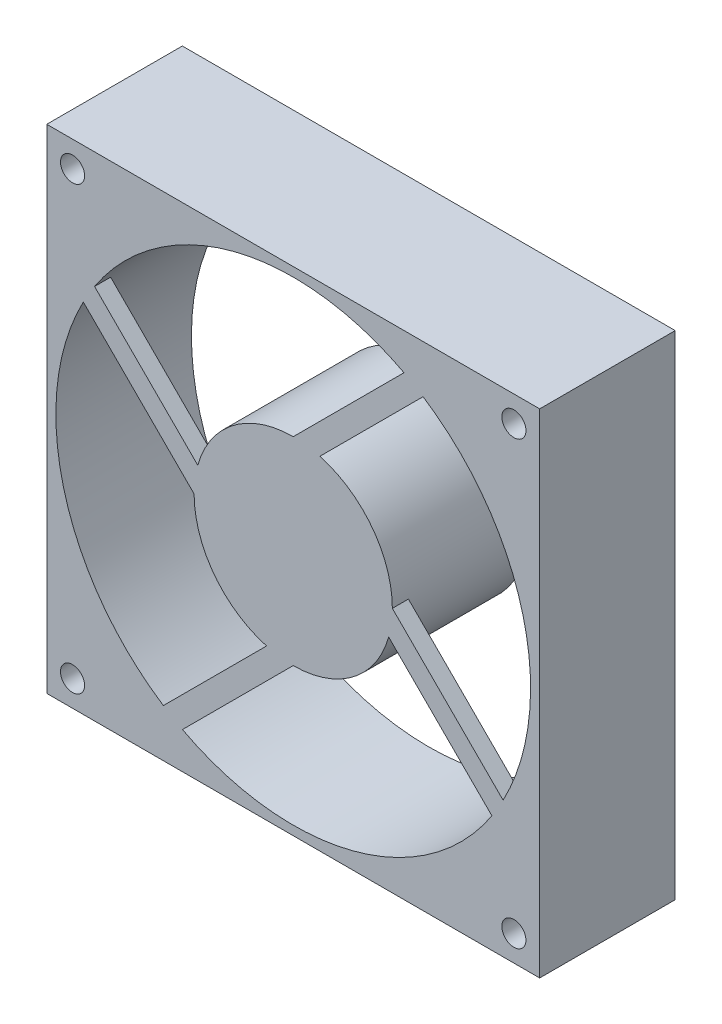
ISO-10303-21;
HEADER;
FILE_DESCRIPTION(('STEP AP214'),'2;1');
FILE_NAME('part.step','',(''),(''),'','','');
FILE_SCHEMA(('AUTOMOTIVE_DESIGN { 1 0 10303 214 1 1 1 1 }'));
ENDSEC;
DATA;
#1=APPLICATION_CONTEXT('core data for automotive mechanical design processes');
#2=APPLICATION_PROTOCOL_DEFINITION('international standard','automotive_design',2000,#1);
#3=PRODUCT_CONTEXT('',#1,'mechanical');
#4=PRODUCT('Part','Part','',(#3));
#5=PRODUCT_RELATED_PRODUCT_CATEGORY('part','',(#4));
#6=PRODUCT_DEFINITION_FORMATION('','',#4);
#7=PRODUCT_DEFINITION_CONTEXT('part definition',#1,'design');
#8=PRODUCT_DEFINITION('design','',#6,#7);
#9=PRODUCT_DEFINITION_SHAPE('','',#8);
#10=(LENGTH_UNIT() NAMED_UNIT(*) SI_UNIT(.MILLI.,.METRE.));
#11=(NAMED_UNIT(*) PLANE_ANGLE_UNIT() SI_UNIT($,.RADIAN.));
#12=(NAMED_UNIT(*) SI_UNIT($,.STERADIAN.) SOLID_ANGLE_UNIT());
#13=UNCERTAINTY_MEASURE_WITH_UNIT(LENGTH_MEASURE(1.E-05),#10,'distance_accuracy_value','');
#14=(GEOMETRIC_REPRESENTATION_CONTEXT(3) GLOBAL_UNCERTAINTY_ASSIGNED_CONTEXT((#13)) GLOBAL_UNIT_ASSIGNED_CONTEXT((#10,
#11,#12)) REPRESENTATION_CONTEXT('',''));
#15=CARTESIAN_POINT('',(0.,0.,0.));
#16=DIRECTION('',(0.,0.,1.));
#17=DIRECTION('',(1.,0.,0.));
#18=AXIS2_PLACEMENT_3D('',#15,#16,#17);
#19=CARTESIAN_POINT('',(0.,-46.,12.65));
#20=DIRECTION('',(0.,1.,0.));
#21=DIRECTION('',(0.,0.,1.));
#22=AXIS2_PLACEMENT_3D('',#19,#20,#21);
#23=PLANE('',#22);
#24=DIRECTION('',(1.,0.,0.));
#25=VECTOR('',#24,1.);
#26=CARTESIAN_POINT('',(0.,-46.,-12.65));
#27=LINE('',#26,#25);
#28=CARTESIAN_POINT('',(-46.,-46.,-12.65));
#29=VERTEX_POINT('',#28);
#30=CARTESIAN_POINT('',(46.,-46.,-12.65));
#31=VERTEX_POINT('',#30);
#32=EDGE_CURVE('E355',#29,#31,#27,.T.);
#33=ORIENTED_EDGE('',*,*,#32,.T.);
#34=DIRECTION('',(0.,0.,-1.));
#35=VECTOR('',#34,1.);
#36=CARTESIAN_POINT('',(46.,-46.,12.65));
#37=LINE('',#36,#35);
#38=CARTESIAN_POINT('',(46.,-46.,12.65));
#39=VERTEX_POINT('',#38);
#40=EDGE_CURVE('E12',#39,#31,#37,.T.);
#41=ORIENTED_EDGE('',*,*,#40,.F.);
#42=DIRECTION('',(1.,0.,0.));
#43=VECTOR('',#42,1.);
#44=CARTESIAN_POINT('',(0.,-46.,12.65));
#45=LINE('',#44,#43);
#46=CARTESIAN_POINT('',(-46.,-46.,12.65));
#47=VERTEX_POINT('',#46);
#48=EDGE_CURVE('E329',#47,#39,#45,.T.);
#49=ORIENTED_EDGE('',*,*,#48,.F.);
#50=DIRECTION('',(0.,0.,-1.));
#51=VECTOR('',#50,1.);
#52=CARTESIAN_POINT('',(-46.,-46.,12.65));
#53=LINE('',#52,#51);
#54=EDGE_CURVE('E340',#47,#29,#53,.T.);
#55=ORIENTED_EDGE('',*,*,#54,.T.);
#56=EDGE_LOOP('',(#33,#41,#49,#55));
#57=FACE_BOUND('',#56,.T.);
#58=ADVANCED_FACE('F49',(#57),#23,.F.);
#59=CARTESIAN_POINT('',(46.,0.,12.65));
#60=DIRECTION('',(-1.,0.,0.));
#61=DIRECTION('',(0.,0.,1.));
#62=AXIS2_PLACEMENT_3D('',#59,#60,#61);
#63=PLANE('',#62);
#64=DIRECTION('',(0.,1.,0.));
#65=VECTOR('',#64,1.);
#66=CARTESIAN_POINT('',(46.,0.,-12.65));
#67=LINE('',#66,#65);
#68=CARTESIAN_POINT('',(46.,46.,-12.65));
#69=VERTEX_POINT('',#68);
#70=EDGE_CURVE('E358',#31,#69,#67,.T.);
#71=ORIENTED_EDGE('',*,*,#70,.T.);
#72=DIRECTION('',(0.,0.,-1.));
#73=VECTOR('',#72,1.);
#74=CARTESIAN_POINT('',(46.,46.,12.65));
#75=LINE('',#74,#73);
#76=CARTESIAN_POINT('',(46.,46.,12.65));
#77=VERTEX_POINT('',#76);
#78=EDGE_CURVE('E57',#77,#69,#75,.T.);
#79=ORIENTED_EDGE('',*,*,#78,.F.);
#80=DIRECTION('',(0.,1.,0.));
#81=VECTOR('',#80,1.);
#82=CARTESIAN_POINT('',(46.,0.,12.65));
#83=LINE('',#82,#81);
#84=EDGE_CURVE('E332',#39,#77,#83,.T.);
#85=ORIENTED_EDGE('',*,*,#84,.F.);
#86=ORIENTED_EDGE('',*,*,#40,.T.);
#87=EDGE_LOOP('',(#71,#79,#85,#86));
#88=FACE_BOUND('',#87,.T.);
#89=ADVANCED_FACE('F375',(#88),#63,.F.);
#90=CARTESIAN_POINT('',(0.,46.,12.65));
#91=DIRECTION('',(0.,1.,0.));
#92=DIRECTION('',(0.,0.,1.));
#93=AXIS2_PLACEMENT_3D('',#90,#91,#92);
#94=PLANE('',#93);
#95=DIRECTION('',(1.,0.,0.));
#96=VECTOR('',#95,1.);
#97=CARTESIAN_POINT('',(0.,46.,-12.65));
#98=LINE('',#97,#96);
#99=CARTESIAN_POINT('',(-46.,46.,-12.65));
#100=VERTEX_POINT('',#99);
#101=EDGE_CURVE('E361',#100,#69,#98,.T.);
#102=ORIENTED_EDGE('',*,*,#101,.F.);
#103=DIRECTION('',(0.,0.,-1.));
#104=VECTOR('',#103,1.);
#105=CARTESIAN_POINT('',(-46.,46.,12.65));
#106=LINE('',#105,#104);
#107=CARTESIAN_POINT('',(-46.,46.,12.65));
#108=VERTEX_POINT('',#107);
#109=EDGE_CURVE('E368',#108,#100,#106,.T.);
#110=ORIENTED_EDGE('',*,*,#109,.F.);
#111=DIRECTION('',(1.,0.,0.));
#112=VECTOR('',#111,1.);
#113=CARTESIAN_POINT('',(0.,46.,12.65));
#114=LINE('',#113,#112);
#115=EDGE_CURVE('E334',#108,#77,#114,.T.);
#116=ORIENTED_EDGE('',*,*,#115,.T.);
#117=ORIENTED_EDGE('',*,*,#78,.T.);
#118=EDGE_LOOP('',(#102,#110,#116,#117));
#119=FACE_BOUND('',#118,.T.);
#120=ADVANCED_FACE('F372',(#119),#94,.T.);
#121=CARTESIAN_POINT('',(-41.1889700041164,41.1889700041164,12.65));
#122=DIRECTION('',(0.,0.,-1.));
#123=DIRECTION('',(-1.,0.,0.));
#124=AXIS2_PLACEMENT_3D('',#121,#122,#123);
#125=CYLINDRICAL_SURFACE('',#124,2.25);
#126=CARTESIAN_POINT('',(-41.1889700041164,41.1889700041164,12.65));
#127=DIRECTION('',(0.,0.,1.));
#128=DIRECTION('',(1.,0.,0.));
#129=AXIS2_PLACEMENT_3D('',#126,#127,#128);
#130=CIRCLE('',#129,2.25);
#131=CARTESIAN_POINT('',(-38.9389700041164,41.1889700041164,12.65));
#132=VERTEX_POINT('',#131);
#133=EDGE_CURVE('E326',#132,#132,#130,.T.);
#134=ORIENTED_EDGE('',*,*,#133,.T.);
#135=EDGE_LOOP('',(#134));
#136=FACE_BOUND('',#135,.T.);
#137=CARTESIAN_POINT('',(-41.1889700041164,41.1889700041164,-12.65));
#138=DIRECTION('',(0.,0.,1.));
#139=DIRECTION('',(1.,0.,0.));
#140=AXIS2_PLACEMENT_3D('',#137,#138,#139);
#141=CIRCLE('',#140,2.25);
#142=CARTESIAN_POINT('',(-38.9389700041164,41.1889700041164,-12.65));
#143=VERTEX_POINT('',#142);
#144=EDGE_CURVE('E352',#143,#143,#141,.T.);
#145=ORIENTED_EDGE('',*,*,#144,.F.);
#146=EDGE_LOOP('',(#145));
#147=FACE_BOUND('',#146,.T.);
#148=ADVANCED_FACE('F396',(#136,#147),#125,.F.);
#149=CARTESIAN_POINT('',(41.1889700041164,41.1889700041164,12.65));
#150=DIRECTION('',(0.,0.,-1.));
#151=DIRECTION('',(-1.,0.,0.));
#152=AXIS2_PLACEMENT_3D('',#149,#150,#151);
#153=CYLINDRICAL_SURFACE('',#152,2.25);
#154=CARTESIAN_POINT('',(41.1889700041164,41.1889700041164,12.65));
#155=DIRECTION('',(0.,0.,1.));
#156=DIRECTION('',(1.,0.,0.));
#157=AXIS2_PLACEMENT_3D('',#154,#155,#156);
#158=CIRCLE('',#157,2.25);
#159=CARTESIAN_POINT('',(43.4389700041164,41.1889700041164,12.65));
#160=VERTEX_POINT('',#159);
#161=EDGE_CURVE('E323',#160,#160,#158,.T.);
#162=ORIENTED_EDGE('',*,*,#161,.T.);
#163=EDGE_LOOP('',(#162));
#164=FACE_BOUND('',#163,.T.);
#165=CARTESIAN_POINT('',(41.1889700041164,41.1889700041164,-12.65));
#166=DIRECTION('',(0.,0.,1.));
#167=DIRECTION('',(1.,0.,0.));
#168=AXIS2_PLACEMENT_3D('',#165,#166,#167);
#169=CIRCLE('',#168,2.25);
#170=CARTESIAN_POINT('',(43.4389700041164,41.1889700041164,-12.65));
#171=VERTEX_POINT('',#170);
#172=EDGE_CURVE('E349',#171,#171,#169,.T.);
#173=ORIENTED_EDGE('',*,*,#172,.F.);
#174=EDGE_LOOP('',(#173));
#175=FACE_BOUND('',#174,.T.);
#176=ADVANCED_FACE('F399',(#164,#175),#153,.F.);
#177=CARTESIAN_POINT('',(41.1889700041164,-41.1889700041164,12.65));
#178=DIRECTION('',(0.,0.,-1.));
#179=DIRECTION('',(-1.,0.,0.));
#180=AXIS2_PLACEMENT_3D('',#177,#178,#179);
#181=CYLINDRICAL_SURFACE('',#180,2.25);
#182=CARTESIAN_POINT('',(41.1889700041164,-41.1889700041164,12.65));
#183=DIRECTION('',(0.,0.,1.));
#184=DIRECTION('',(1.,0.,0.));
#185=AXIS2_PLACEMENT_3D('',#182,#183,#184);
#186=CIRCLE('',#185,2.25);
#187=CARTESIAN_POINT('',(43.4389700041164,-41.1889700041164,12.65));
#188=VERTEX_POINT('',#187);
#189=EDGE_CURVE('E320',#188,#188,#186,.T.);
#190=ORIENTED_EDGE('',*,*,#189,.T.);
#191=EDGE_LOOP('',(#190));
#192=FACE_BOUND('',#191,.T.);
#193=CARTESIAN_POINT('',(41.1889700041164,-41.1889700041164,-12.65));
#194=DIRECTION('',(0.,0.,1.));
#195=DIRECTION('',(1.,0.,0.));
#196=AXIS2_PLACEMENT_3D('',#193,#194,#195);
#197=CIRCLE('',#196,2.25);
#198=CARTESIAN_POINT('',(43.4389700041164,-41.1889700041164,-12.65));
#199=VERTEX_POINT('',#198);
#200=EDGE_CURVE('E346',#199,#199,#197,.T.);
#201=ORIENTED_EDGE('',*,*,#200,.F.);
#202=EDGE_LOOP('',(#201));
#203=FACE_BOUND('',#202,.T.);
#204=ADVANCED_FACE('F403',(#192,#203),#181,.F.);
#205=CARTESIAN_POINT('',(-41.1889700041164,-41.1889700041164,12.65));
#206=DIRECTION('',(0.,0.,-1.));
#207=DIRECTION('',(-1.,0.,0.));
#208=AXIS2_PLACEMENT_3D('',#205,#206,#207);
#209=CYLINDRICAL_SURFACE('',#208,2.25);
#210=CARTESIAN_POINT('',(-41.1889700041164,-41.1889700041164,12.65));
#211=DIRECTION('',(0.,0.,1.));
#212=DIRECTION('',(1.,0.,0.));
#213=AXIS2_PLACEMENT_3D('',#210,#211,#212);
#214=CIRCLE('',#213,2.25);
#215=CARTESIAN_POINT('',(-38.9389700041164,-41.1889700041164,12.65));
#216=VERTEX_POINT('',#215);
#217=EDGE_CURVE('E315',#216,#216,#214,.T.);
#218=ORIENTED_EDGE('',*,*,#217,.T.);
#219=EDGE_LOOP('',(#218));
#220=FACE_BOUND('',#219,.T.);
#221=CARTESIAN_POINT('',(-41.1889700041164,-41.1889700041164,-12.65));
#222=DIRECTION('',(0.,0.,1.));
#223=DIRECTION('',(1.,0.,0.));
#224=AXIS2_PLACEMENT_3D('',#221,#222,#223);
#225=CIRCLE('',#224,2.25);
#226=CARTESIAN_POINT('',(-38.9389700041164,-41.1889700041164,-12.65));
#227=VERTEX_POINT('',#226);
#228=EDGE_CURVE('E343',#227,#227,#225,.T.);
#229=ORIENTED_EDGE('',*,*,#228,.F.);
#230=EDGE_LOOP('',(#229));
#231=FACE_BOUND('',#230,.T.);
#232=ADVANCED_FACE('F406',(#220,#231),#209,.F.);
#233=CARTESIAN_POINT('',(0.,0.,12.65));
#234=DIRECTION('',(0.,0.,-1.));
#235=DIRECTION('',(-1.,0.,0.));
#236=AXIS2_PLACEMENT_3D('',#233,#234,#235);
#237=CYLINDRICAL_SURFACE('',#236,44.3);
#238=DIRECTION('',(0.,0.,1.));
#239=VECTOR('',#238,1.);
#240=CARTESIAN_POINT('',(39.177955159015,-20.6779551590144,9.65));
#241=LINE('',#240,#239);
#242=CARTESIAN_POINT('',(39.177955159015,-20.6779551590144,9.65));
#243=VERTEX_POINT('',#242);
#244=CARTESIAN_POINT('',(39.177955159015,-20.6779551590144,12.65));
#245=VERTEX_POINT('',#244);
#246=EDGE_CURVE('E218',#243,#245,#241,.T.);
#247=ORIENTED_EDGE('',*,*,#246,.T.);
#248=CARTESIAN_POINT('',(0.,0.,12.65));
#249=DIRECTION('',(0.,0.,1.));
#250=DIRECTION('',(1.,0.,0.));
#251=AXIS2_PLACEMENT_3D('',#248,#249,#250);
#252=CIRCLE('',#251,44.3);
#253=CARTESIAN_POINT('',(24.2379835763292,37.0811293268368,12.65));
#254=VERTEX_POINT('',#253);
#255=EDGE_CURVE('E317',#245,#254,#252,.T.);
#256=ORIENTED_EDGE('',*,*,#255,.T.);
#257=DIRECTION('',(0.,0.,1.));
#258=VECTOR('',#257,1.);
#259=CARTESIAN_POINT('',(24.2379835763292,37.0811293268368,9.65));
#260=LINE('',#259,#258);
#261=CARTESIAN_POINT('',(24.2379835763292,37.0811293268368,9.65));
#262=VERTEX_POINT('',#261);
#263=EDGE_CURVE('E308',#262,#254,#260,.T.);
#264=ORIENTED_EDGE('',*,*,#263,.F.);
#265=CARTESIAN_POINT('',(0.,0.,9.65));
#266=DIRECTION('',(0.,0.,1.));
#267=DIRECTION('',(-1.,0.,0.));
#268=AXIS2_PLACEMENT_3D('',#265,#266,#267);
#269=CIRCLE('',#268,44.3);
#270=CARTESIAN_POINT('',(20.6779551590148,39.1779551590148,9.65));
#271=VERTEX_POINT('',#270);
#272=EDGE_CURVE('E292',#262,#271,#269,.T.);
#273=ORIENTED_EDGE('',*,*,#272,.T.);
#274=DIRECTION('',(0.,0.,1.));
#275=VECTOR('',#274,1.);
#276=CARTESIAN_POINT('',(20.6779551590148,39.1779551590148,9.65));
#277=LINE('',#276,#275);
#278=CARTESIAN_POINT('',(20.6779551590148,39.1779551590148,12.65));
#279=VERTEX_POINT('',#278);
#280=EDGE_CURVE('E305',#271,#279,#277,.T.);
#281=ORIENTED_EDGE('',*,*,#280,.T.);
#282=CARTESIAN_POINT('',(-37.0811293268369,24.2379835763291,12.65));
#283=VERTEX_POINT('',#282);
#284=EDGE_CURVE('E313',#279,#283,#252,.T.);
#285=ORIENTED_EDGE('',*,*,#284,.T.);
#286=DIRECTION('',(0.,0.,1.));
#287=VECTOR('',#286,1.);
#288=CARTESIAN_POINT('',(-37.0811293268369,24.2379835763291,9.65));
#289=LINE('',#288,#287);
#290=CARTESIAN_POINT('',(-37.0811293268369,24.2379835763291,9.65));
#291=VERTEX_POINT('',#290);
#292=EDGE_CURVE('E272',#291,#283,#289,.T.);
#293=ORIENTED_EDGE('',*,*,#292,.F.);
#294=CARTESIAN_POINT('',(0.,0.,9.65));
#295=DIRECTION('',(0.,0.,1.));
#296=DIRECTION('',(0.,-1.,0.));
#297=AXIS2_PLACEMENT_3D('',#294,#295,#296);
#298=CIRCLE('',#297,44.3);
#299=CARTESIAN_POINT('',(-39.1779551590148,20.6779551590147,9.65));
#300=VERTEX_POINT('',#299);
#301=EDGE_CURVE('E256',#291,#300,#298,.T.);
#302=ORIENTED_EDGE('',*,*,#301,.T.);
#303=DIRECTION('',(0.,0.,1.));
#304=VECTOR('',#303,1.);
#305=CARTESIAN_POINT('',(-39.1779551590148,20.6779551590147,9.65));
#306=LINE('',#305,#304);
#307=CARTESIAN_POINT('',(-39.1779551590148,20.6779551590147,12.65));
#308=VERTEX_POINT('',#307);
#309=EDGE_CURVE('E269',#300,#308,#306,.T.);
#310=ORIENTED_EDGE('',*,*,#309,.T.);
#311=CARTESIAN_POINT('',(-24.2379835763292,-37.0811293268368,12.65));
#312=VERTEX_POINT('',#311);
#313=EDGE_CURVE('E316',#308,#312,#252,.T.);
#314=ORIENTED_EDGE('',*,*,#313,.T.);
#315=DIRECTION('',(0.,0.,1.));
#316=VECTOR('',#315,1.);
#317=CARTESIAN_POINT('',(-24.2379835763292,-37.0811293268368,9.65));
#318=LINE('',#317,#316);
#319=CARTESIAN_POINT('',(-24.2379835763292,-37.0811293268368,9.65));
#320=VERTEX_POINT('',#319);
#321=EDGE_CURVE('E244',#320,#312,#318,.T.);
#322=ORIENTED_EDGE('',*,*,#321,.F.);
#323=CARTESIAN_POINT('',(0.,0.,9.65));
#324=DIRECTION('',(0.,0.,1.));
#325=DIRECTION('',(1.,0.,0.));
#326=AXIS2_PLACEMENT_3D('',#323,#324,#325);
#327=CIRCLE('',#326,44.3);
#328=CARTESIAN_POINT('',(-20.6779551590148,-39.1779551590148,9.65));
#329=VERTEX_POINT('',#328);
#330=EDGE_CURVE('E228',#320,#329,#327,.T.);
#331=ORIENTED_EDGE('',*,*,#330,.T.);
#332=DIRECTION('',(0.,0.,1.));
#333=VECTOR('',#332,1.);
#334=CARTESIAN_POINT('',(-20.6779551590148,-39.1779551590148,9.65));
#335=LINE('',#334,#333);
#336=CARTESIAN_POINT('',(-20.6779551590148,-39.1779551590148,12.65));
#337=VERTEX_POINT('',#336);
#338=EDGE_CURVE('E241',#329,#337,#335,.T.);
#339=ORIENTED_EDGE('',*,*,#338,.T.);
#340=CARTESIAN_POINT('',(37.081129326837,-24.2379835763288,12.65));
#341=VERTEX_POINT('',#340);
#342=EDGE_CURVE('E625',#337,#341,#252,.T.);
#343=ORIENTED_EDGE('',*,*,#342,.T.);
#344=DIRECTION('',(0.,0.,1.));
#345=VECTOR('',#344,1.);
#346=CARTESIAN_POINT('',(37.081129326837,-24.2379835763288,9.65));
#347=LINE('',#346,#345);
#348=CARTESIAN_POINT('',(37.081129326837,-24.2379835763288,9.65));
#349=VERTEX_POINT('',#348);
#350=EDGE_CURVE('E64',#349,#341,#347,.T.);
#351=ORIENTED_EDGE('',*,*,#350,.F.);
#352=CARTESIAN_POINT('',(0.,0.,9.65));
#353=DIRECTION('',(0.,0.,1.));
#354=DIRECTION('',(0.,1.,0.));
#355=AXIS2_PLACEMENT_3D('',#352,#353,#354);
#356=CIRCLE('',#355,44.3);
#357=EDGE_CURVE('E68',#349,#243,#356,.T.);
#358=ORIENTED_EDGE('',*,*,#357,.T.);
#359=EDGE_LOOP('',(#247,#256,#264,#273,#281,#285,#293,#302,#310,#314,#322,#331,#339,#343,#351,#358));
#360=FACE_BOUND('',#359,.T.);
#361=CARTESIAN_POINT('',(0.,0.,-12.65));
#362=DIRECTION('',(0.,0.,1.));
#363=DIRECTION('',(1.,0.,0.));
#364=AXIS2_PLACEMENT_3D('',#361,#362,#363);
#365=CIRCLE('',#364,44.3);
#366=CARTESIAN_POINT('',(44.3,0.,-12.65));
#367=VERTEX_POINT('',#366);
#368=EDGE_CURVE('E304',#367,#367,#365,.T.);
#369=ORIENTED_EDGE('',*,*,#368,.F.);
#370=EDGE_LOOP('',(#369));
#371=FACE_BOUND('',#370,.T.);
#372=ADVANCED_FACE('F51',(#360,#371),#237,.F.);
#373=CARTESIAN_POINT('',(-46.,0.,12.65));
#374=DIRECTION('',(-1.,0.,0.));
#375=DIRECTION('',(0.,0.,1.));
#376=AXIS2_PLACEMENT_3D('',#373,#374,#375);
#377=PLANE('',#376);
#378=DIRECTION('',(0.,1.,0.));
#379=VECTOR('',#378,1.);
#380=CARTESIAN_POINT('',(-46.,0.,-12.65));
#381=LINE('',#380,#379);
#382=EDGE_CURVE('E364',#29,#100,#381,.T.);
#383=ORIENTED_EDGE('',*,*,#382,.F.);
#384=ORIENTED_EDGE('',*,*,#54,.F.);
#385=DIRECTION('',(0.,1.,0.));
#386=VECTOR('',#385,1.);
#387=CARTESIAN_POINT('',(-46.,0.,12.65));
#388=LINE('',#387,#386);
#389=EDGE_CURVE('E337',#47,#108,#388,.T.);
#390=ORIENTED_EDGE('',*,*,#389,.T.);
#391=ORIENTED_EDGE('',*,*,#109,.T.);
#392=EDGE_LOOP('',(#383,#384,#390,#391));
#393=FACE_BOUND('',#392,.T.);
#394=ADVANCED_FACE('F382',(#393),#377,.T.);
#395=CARTESIAN_POINT('',(0.,0.,12.65));
#396=DIRECTION('',(0.,0.,1.));
#397=DIRECTION('',(1.,0.,0.));
#398=AXIS2_PLACEMENT_3D('',#395,#396,#397);
#399=PLANE('',#398);
#400=ORIENTED_EDGE('',*,*,#255,.F.);
#401=DIRECTION('',(-0.707106781186554,0.707106781186541,0.));
#402=VECTOR('',#401,1.);
#403=CARTESIAN_POINT('',(18.5,1.783815434565E-13,12.65));
#404=LINE('',#403,#402);
#405=CARTESIAN_POINT('',(18.5,1.783815434565E-13,12.65));
#406=VERTEX_POINT('',#405);
#407=EDGE_CURVE('E209',#245,#406,#404,.T.);
#408=ORIENTED_EDGE('',*,*,#407,.T.);
#409=CARTESIAN_POINT('',(0.,0.,12.65));
#410=DIRECTION('',(0.,0.,1.));
#411=DIRECTION('',(1.,0.,0.));
#412=AXIS2_PLACEMENT_3D('',#409,#410,#411);
#413=CIRCLE('',#412,18.5);
#414=CARTESIAN_POINT('',(4.97528642052613,17.8184321710337,12.65));
#415=VERTEX_POINT('',#414);
#416=EDGE_CURVE('E282',#406,#415,#413,.T.);
#417=ORIENTED_EDGE('',*,*,#416,.T.);
#418=DIRECTION('',(0.707106781186549,0.707106781186546,0.));
#419=VECTOR('',#418,1.);
#420=CARTESIAN_POINT('',(4.97528642052613,17.8184321710337,12.65));
#421=LINE('',#420,#419);
#422=EDGE_CURVE('E280',#415,#254,#421,.T.);
#423=ORIENTED_EDGE('',*,*,#422,.T.);
#424=EDGE_LOOP('',(#400,#408,#417,#423));
#425=FACE_BOUND('',#424,.T.);
#426=ORIENTED_EDGE('',*,*,#342,.F.);
#427=DIRECTION('',(0.707106781186548,0.707106781186547,0.));
#428=VECTOR('',#427,1.);
#429=CARTESIAN_POINT('',(0.,-18.5,12.65));
#430=LINE('',#429,#428);
#431=CARTESIAN_POINT('',(0.,-18.5,12.65));
#432=VERTEX_POINT('',#431);
#433=EDGE_CURVE('E225',#337,#432,#430,.T.);
#434=ORIENTED_EDGE('',*,*,#433,.T.);
#435=CARTESIAN_POINT('',(17.8184321710338,-4.97528642052595,12.65));
#436=VERTEX_POINT('',#435);
#437=EDGE_CURVE('E637',#432,#436,#413,.T.);
#438=ORIENTED_EDGE('',*,*,#437,.T.);
#439=DIRECTION('',(0.707106781186554,-0.707106781186541,0.));
#440=VECTOR('',#439,1.);
#441=CARTESIAN_POINT('',(17.8184321710338,-4.97528642052595,12.65));
#442=LINE('',#441,#440);
#443=EDGE_CURVE('E190',#436,#341,#442,.T.);
#444=ORIENTED_EDGE('',*,*,#443,.T.);
#445=EDGE_LOOP('',(#426,#434,#438,#444));
#446=FACE_BOUND('',#445,.T.);
#447=ORIENTED_EDGE('',*,*,#313,.F.);
#448=DIRECTION('',(0.707106781186549,-0.707106781186546,0.));
#449=VECTOR('',#448,1.);
#450=CARTESIAN_POINT('',(-18.5,0.,12.65));
#451=LINE('',#450,#449);
#452=CARTESIAN_POINT('',(-18.5,0.,12.65));
#453=VERTEX_POINT('',#452);
#454=EDGE_CURVE('E253',#308,#453,#451,.T.);
#455=ORIENTED_EDGE('',*,*,#454,.T.);
#456=CARTESIAN_POINT('',(-4.97528642052613,-17.8184321710337,12.65));
#457=VERTEX_POINT('',#456);
#458=EDGE_CURVE('E281',#453,#457,#413,.T.);
#459=ORIENTED_EDGE('',*,*,#458,.T.);
#460=DIRECTION('',(-0.707106781186549,-0.707106781186546,0.));
#461=VECTOR('',#460,1.);
#462=CARTESIAN_POINT('',(-4.97528642052613,-17.8184321710337,12.65));
#463=LINE('',#462,#461);
#464=EDGE_CURVE('E217',#457,#312,#463,.T.);
#465=ORIENTED_EDGE('',*,*,#464,.T.);
#466=EDGE_LOOP('',(#447,#455,#459,#465));
#467=FACE_BOUND('',#466,.T.);
#468=ORIENTED_EDGE('',*,*,#284,.F.);
#469=DIRECTION('',(-0.707106781186548,-0.707106781186547,0.));
#470=VECTOR('',#469,1.);
#471=CARTESIAN_POINT('',(0.,18.5,12.65));
#472=LINE('',#471,#470);
#473=CARTESIAN_POINT('',(0.,18.5,12.65));
#474=VERTEX_POINT('',#473);
#475=EDGE_CURVE('E289',#279,#474,#472,.T.);
#476=ORIENTED_EDGE('',*,*,#475,.T.);
#477=CARTESIAN_POINT('',(-17.8184321710338,4.97528642052607,12.65));
#478=VERTEX_POINT('',#477);
#479=EDGE_CURVE('E277',#474,#478,#413,.T.);
#480=ORIENTED_EDGE('',*,*,#479,.T.);
#481=DIRECTION('',(-0.707106781186549,0.707106781186546,0.));
#482=VECTOR('',#481,1.);
#483=CARTESIAN_POINT('',(-17.8184321710338,4.97528642052607,12.65));
#484=LINE('',#483,#482);
#485=EDGE_CURVE('E240',#478,#283,#484,.T.);
#486=ORIENTED_EDGE('',*,*,#485,.T.);
#487=EDGE_LOOP('',(#468,#476,#480,#486));
#488=FACE_BOUND('',#487,.T.);
#489=ORIENTED_EDGE('',*,*,#217,.F.);
#490=EDGE_LOOP('',(#489));
#491=FACE_BOUND('',#490,.T.);
#492=ORIENTED_EDGE('',*,*,#189,.F.);
#493=EDGE_LOOP('',(#492));
#494=FACE_BOUND('',#493,.T.);
#495=ORIENTED_EDGE('',*,*,#161,.F.);
#496=EDGE_LOOP('',(#495));
#497=FACE_BOUND('',#496,.T.);
#498=ORIENTED_EDGE('',*,*,#133,.F.);
#499=EDGE_LOOP('',(#498));
#500=FACE_BOUND('',#499,.T.);
#501=ORIENTED_EDGE('',*,*,#48,.T.);
#502=ORIENTED_EDGE('',*,*,#84,.T.);
#503=ORIENTED_EDGE('',*,*,#115,.F.);
#504=ORIENTED_EDGE('',*,*,#389,.F.);
#505=EDGE_LOOP('',(#501,#502,#503,#504));
#506=FACE_BOUND('',#505,.T.);
#507=ADVANCED_FACE('F386',(#425,#446,#467,#488,#491,#494,#497,#500,#506),#399,.T.);
#508=CARTESIAN_POINT('',(0.,0.,-12.65));
#509=DIRECTION('',(0.,0.,1.));
#510=DIRECTION('',(1.,0.,0.));
#511=AXIS2_PLACEMENT_3D('',#508,#509,#510);
#512=PLANE('',#511);
#513=ORIENTED_EDGE('',*,*,#368,.T.);
#514=EDGE_LOOP('',(#513));
#515=FACE_BOUND('',#514,.T.);
#516=ORIENTED_EDGE('',*,*,#228,.T.);
#517=EDGE_LOOP('',(#516));
#518=FACE_BOUND('',#517,.T.);
#519=ORIENTED_EDGE('',*,*,#200,.T.);
#520=EDGE_LOOP('',(#519));
#521=FACE_BOUND('',#520,.T.);
#522=ORIENTED_EDGE('',*,*,#172,.T.);
#523=EDGE_LOOP('',(#522));
#524=FACE_BOUND('',#523,.T.);
#525=ORIENTED_EDGE('',*,*,#144,.T.);
#526=EDGE_LOOP('',(#525));
#527=FACE_BOUND('',#526,.T.);
#528=ORIENTED_EDGE('',*,*,#32,.F.);
#529=ORIENTED_EDGE('',*,*,#382,.T.);
#530=ORIENTED_EDGE('',*,*,#101,.T.);
#531=ORIENTED_EDGE('',*,*,#70,.F.);
#532=EDGE_LOOP('',(#528,#529,#530,#531));
#533=FACE_BOUND('',#532,.T.);
#534=ADVANCED_FACE('F379',(#515,#518,#521,#524,#527,#533),#512,.F.);
#535=CARTESIAN_POINT('',(0.,18.5,9.65));
#536=DIRECTION('',(-0.707106781186547,0.707106781186548,0.));
#537=DIRECTION('',(-0.707106781186548,-0.707106781186547,0.));
#538=AXIS2_PLACEMENT_3D('',#535,#536,#537);
#539=PLANE('',#538);
#540=ORIENTED_EDGE('',*,*,#475,.F.);
#541=ORIENTED_EDGE('',*,*,#280,.F.);
#542=DIRECTION('',(-0.707106781186548,-0.707106781186547,0.));
#543=VECTOR('',#542,1.);
#544=CARTESIAN_POINT('',(0.,18.5,9.65));
#545=LINE('',#544,#543);
#546=CARTESIAN_POINT('',(0.,18.5,9.65));
#547=VERTEX_POINT('',#546);
#548=EDGE_CURVE('E294',#271,#547,#545,.T.);
#549=ORIENTED_EDGE('',*,*,#548,.T.);
#550=DIRECTION('',(0.,0.,1.));
#551=VECTOR('',#550,1.);
#552=CARTESIAN_POINT('',(0.,18.5,9.65));
#553=LINE('',#552,#551);
#554=EDGE_CURVE('E302',#547,#474,#553,.T.);
#555=ORIENTED_EDGE('',*,*,#554,.T.);
#556=EDGE_LOOP('',(#540,#541,#549,#555));
#557=FACE_BOUND('',#556,.T.);
#558=ADVANCED_FACE('F419',(#557),#539,.T.);
#559=CARTESIAN_POINT('',(4.97528642052613,17.8184321710337,9.65));
#560=DIRECTION('',(0.707106781186546,-0.707106781186549,0.));
#561=DIRECTION('',(0.707106781186549,0.707106781186546,0.));
#562=AXIS2_PLACEMENT_3D('',#559,#560,#561);
#563=PLANE('',#562);
#564=ORIENTED_EDGE('',*,*,#422,.F.);
#565=DIRECTION('',(0.,0.,1.));
#566=VECTOR('',#565,1.);
#567=CARTESIAN_POINT('',(4.97528642052613,17.8184321710337,9.65));
#568=LINE('',#567,#566);
#569=CARTESIAN_POINT('',(4.97528642052612,17.8184321710337,9.65));
#570=VERTEX_POINT('',#569);
#571=EDGE_CURVE('E297',#570,#415,#568,.T.);
#572=ORIENTED_EDGE('',*,*,#571,.F.);
#573=DIRECTION('',(0.707106781186549,0.707106781186546,0.));
#574=VECTOR('',#573,1.);
#575=CARTESIAN_POINT('',(4.97528642052613,17.8184321710337,9.65));
#576=LINE('',#575,#574);
#577=EDGE_CURVE('E288',#570,#262,#576,.T.);
#578=ORIENTED_EDGE('',*,*,#577,.T.);
#579=ORIENTED_EDGE('',*,*,#263,.T.);
#580=EDGE_LOOP('',(#564,#572,#578,#579));
#581=FACE_BOUND('',#580,.T.);
#582=ADVANCED_FACE('F434',(#581),#563,.T.);
#583=CARTESIAN_POINT('',(0.,0.,9.65));
#584=DIRECTION('',(0.,0.,-1.));
#585=DIRECTION('',(-1.,0.,0.));
#586=AXIS2_PLACEMENT_3D('',#583,#584,#585);
#587=PLANE('',#586);
#588=CARTESIAN_POINT('',(0.,0.,9.65));
#589=DIRECTION('',(0.,0.,-1.));
#590=DIRECTION('',(-1.,0.,0.));
#591=AXIS2_PLACEMENT_3D('',#588,#589,#590);
#592=CIRCLE('',#591,18.5000000000001);
#593=EDGE_CURVE('E285',#547,#570,#592,.T.);
#594=ORIENTED_EDGE('',*,*,#593,.F.);
#595=ORIENTED_EDGE('',*,*,#548,.F.);
#596=ORIENTED_EDGE('',*,*,#272,.F.);
#597=ORIENTED_EDGE('',*,*,#577,.F.);
#598=EDGE_LOOP('',(#594,#595,#596,#597));
#599=FACE_BOUND('',#598,.T.);
#600=ADVANCED_FACE('F492',(#599),#587,.T.);
#601=CARTESIAN_POINT('',(0.,0.,12.65));
#602=DIRECTION('',(0.,0.,-1.));
#603=DIRECTION('',(-1.,0.,0.));
#604=AXIS2_PLACEMENT_3D('',#601,#602,#603);
#605=CYLINDRICAL_SURFACE('',#604,18.5);
#606=ORIENTED_EDGE('',*,*,#416,.F.);
#607=DIRECTION('',(0.,0.,1.));
#608=VECTOR('',#607,1.);
#609=CARTESIAN_POINT('',(18.5,1.783815434565E-13,9.65));
#610=LINE('',#609,#608);
#611=CARTESIAN_POINT('',(18.5,1.783815434565E-13,9.65));
#612=VERTEX_POINT('',#611);
#613=EDGE_CURVE('E208',#612,#406,#610,.T.);
#614=ORIENTED_EDGE('',*,*,#613,.F.);
#615=CARTESIAN_POINT('',(0.,0.,9.65));
#616=DIRECTION('',(0.,0.,-1.));
#617=DIRECTION('',(0.,1.,0.));
#618=AXIS2_PLACEMENT_3D('',#615,#616,#617);
#619=CIRCLE('',#618,18.5000000000001);
#620=CARTESIAN_POINT('',(17.8184321710338,-4.97528642052595,9.65));
#621=VERTEX_POINT('',#620);
#622=EDGE_CURVE('E200',#612,#621,#619,.T.);
#623=ORIENTED_EDGE('',*,*,#622,.T.);
#624=DIRECTION('',(0.,0.,1.));
#625=VECTOR('',#624,1.);
#626=CARTESIAN_POINT('',(17.8184321710338,-4.97528642052595,9.65));
#627=LINE('',#626,#625);
#628=EDGE_CURVE('E185',#621,#436,#627,.T.);
#629=ORIENTED_EDGE('',*,*,#628,.T.);
#630=ORIENTED_EDGE('',*,*,#437,.F.);
#631=DIRECTION('',(0.,0.,1.));
#632=VECTOR('',#631,1.);
#633=CARTESIAN_POINT('',(0.,-18.5,9.65));
#634=LINE('',#633,#632);
#635=CARTESIAN_POINT('',(0.,-18.5,9.65));
#636=VERTEX_POINT('',#635);
#637=EDGE_CURVE('E237',#636,#432,#634,.T.);
#638=ORIENTED_EDGE('',*,*,#637,.F.);
#639=CARTESIAN_POINT('',(0.,0.,9.65));
#640=DIRECTION('',(0.,0.,-1.));
#641=DIRECTION('',(1.,0.,0.));
#642=AXIS2_PLACEMENT_3D('',#639,#640,#641);
#643=CIRCLE('',#642,18.5000000000001);
#644=CARTESIAN_POINT('',(-4.97528642052613,-17.8184321710337,9.65));
#645=VERTEX_POINT('',#644);
#646=EDGE_CURVE('E221',#636,#645,#643,.T.);
#647=ORIENTED_EDGE('',*,*,#646,.T.);
#648=DIRECTION('',(0.,0.,1.));
#649=VECTOR('',#648,1.);
#650=CARTESIAN_POINT('',(-4.97528642052613,-17.8184321710337,9.65));
#651=LINE('',#650,#649);
#652=EDGE_CURVE('E233',#645,#457,#651,.T.);
#653=ORIENTED_EDGE('',*,*,#652,.T.);
#654=ORIENTED_EDGE('',*,*,#458,.F.);
#655=DIRECTION('',(0.,0.,1.));
#656=VECTOR('',#655,1.);
#657=CARTESIAN_POINT('',(-18.5,0.,9.65));
#658=LINE('',#657,#656);
#659=CARTESIAN_POINT('',(-18.5,0.,9.65));
#660=VERTEX_POINT('',#659);
#661=EDGE_CURVE('E265',#660,#453,#658,.T.);
#662=ORIENTED_EDGE('',*,*,#661,.F.);
#663=CARTESIAN_POINT('',(0.,0.,9.65));
#664=DIRECTION('',(0.,0.,-1.));
#665=DIRECTION('',(0.,-1.,0.));
#666=AXIS2_PLACEMENT_3D('',#663,#664,#665);
#667=CIRCLE('',#666,18.5000000000001);
#668=CARTESIAN_POINT('',(-17.8184321710338,4.97528642052607,9.65));
#669=VERTEX_POINT('',#668);
#670=EDGE_CURVE('E249',#660,#669,#667,.T.);
#671=ORIENTED_EDGE('',*,*,#670,.T.);
#672=DIRECTION('',(0.,0.,1.));
#673=VECTOR('',#672,1.);
#674=CARTESIAN_POINT('',(-17.8184321710338,4.97528642052607,9.65));
#675=LINE('',#674,#673);
#676=EDGE_CURVE('E261',#669,#478,#675,.T.);
#677=ORIENTED_EDGE('',*,*,#676,.T.);
#678=ORIENTED_EDGE('',*,*,#479,.F.);
#679=ORIENTED_EDGE('',*,*,#554,.F.);
#680=ORIENTED_EDGE('',*,*,#593,.T.);
#681=ORIENTED_EDGE('',*,*,#571,.T.);
#682=EDGE_LOOP('',(#606,#614,#623,#629,#630,#638,#647,#653,#654,#662,#671,#677,#678,#679,#680,#681));
#683=FACE_BOUND('',#682,.T.);
#684=CARTESIAN_POINT('',(0.,0.,-12.65));
#685=DIRECTION('',(0.,0.,1.));
#686=DIRECTION('',(1.,0.,0.));
#687=AXIS2_PLACEMENT_3D('',#684,#685,#686);
#688=CIRCLE('',#687,18.5);
#689=CARTESIAN_POINT('',(18.5,0.,-12.65));
#690=VERTEX_POINT('',#689);
#691=EDGE_CURVE('E268',#690,#690,#688,.T.);
#692=ORIENTED_EDGE('',*,*,#691,.T.);
#693=EDGE_LOOP('',(#692));
#694=FACE_BOUND('',#693,.T.);
#695=ADVANCED_FACE('F205',(#683,#694),#605,.T.);
#696=CARTESIAN_POINT('',(0.,0.,-12.65));
#697=DIRECTION('',(0.,0.,1.));
#698=DIRECTION('',(1.,0.,0.));
#699=AXIS2_PLACEMENT_3D('',#696,#697,#698);
#700=PLANE('',#699);
#701=ORIENTED_EDGE('',*,*,#691,.F.);
#702=EDGE_LOOP('',(#701));
#703=FACE_BOUND('',#702,.T.);
#704=ADVANCED_FACE('F508',(#703),#700,.F.);
#705=CARTESIAN_POINT('',(-18.5,0.,9.65));
#706=DIRECTION('',(-0.707106781186546,-0.707106781186549,0.));
#707=DIRECTION('',(0.707106781186549,-0.707106781186546,0.));
#708=AXIS2_PLACEMENT_3D('',#705,#706,#707);
#709=PLANE('',#708);
#710=ORIENTED_EDGE('',*,*,#454,.F.);
#711=ORIENTED_EDGE('',*,*,#309,.F.);
#712=DIRECTION('',(0.707106781186549,-0.707106781186546,0.));
#713=VECTOR('',#712,1.);
#714=CARTESIAN_POINT('',(-18.5,0.,9.65));
#715=LINE('',#714,#713);
#716=EDGE_CURVE('E258',#300,#660,#715,.T.);
#717=ORIENTED_EDGE('',*,*,#716,.T.);
#718=ORIENTED_EDGE('',*,*,#661,.T.);
#719=EDGE_LOOP('',(#710,#711,#717,#718));
#720=FACE_BOUND('',#719,.T.);
#721=ADVANCED_FACE('F513',(#720),#709,.T.);
#722=CARTESIAN_POINT('',(-17.8184321710338,4.97528642052607,9.65));
#723=DIRECTION('',(0.707106781186546,0.707106781186549,0.));
#724=DIRECTION('',(-0.707106781186549,0.707106781186546,0.));
#725=AXIS2_PLACEMENT_3D('',#722,#723,#724);
#726=PLANE('',#725);
#727=ORIENTED_EDGE('',*,*,#485,.F.);
#728=ORIENTED_EDGE('',*,*,#676,.F.);
#729=DIRECTION('',(-0.707106781186549,0.707106781186546,0.));
#730=VECTOR('',#729,1.);
#731=CARTESIAN_POINT('',(-17.8184321710338,4.97528642052607,9.65));
#732=LINE('',#731,#730);
#733=EDGE_CURVE('E252',#669,#291,#732,.T.);
#734=ORIENTED_EDGE('',*,*,#733,.T.);
#735=ORIENTED_EDGE('',*,*,#292,.T.);
#736=EDGE_LOOP('',(#727,#728,#734,#735));
#737=FACE_BOUND('',#736,.T.);
#738=ADVANCED_FACE('F542',(#737),#726,.T.);
#739=CARTESIAN_POINT('',(0.,0.,9.65));
#740=DIRECTION('',(0.,0.,-1.));
#741=DIRECTION('',(0.,-1.,0.));
#742=AXIS2_PLACEMENT_3D('',#739,#740,#741);
#743=PLANE('',#742);
#744=ORIENTED_EDGE('',*,*,#670,.F.);
#745=ORIENTED_EDGE('',*,*,#716,.F.);
#746=ORIENTED_EDGE('',*,*,#301,.F.);
#747=ORIENTED_EDGE('',*,*,#733,.F.);
#748=EDGE_LOOP('',(#744,#745,#746,#747));
#749=FACE_BOUND('',#748,.T.);
#750=ADVANCED_FACE('F552',(#749),#743,.T.);
#751=CARTESIAN_POINT('',(0.,-18.5,9.65));
#752=DIRECTION('',(0.707106781186547,-0.707106781186548,0.));
#753=DIRECTION('',(0.707106781186548,0.707106781186547,0.));
#754=AXIS2_PLACEMENT_3D('',#751,#752,#753);
#755=PLANE('',#754);
#756=ORIENTED_EDGE('',*,*,#433,.F.);
#757=ORIENTED_EDGE('',*,*,#338,.F.);
#758=DIRECTION('',(0.707106781186548,0.707106781186547,0.));
#759=VECTOR('',#758,1.);
#760=CARTESIAN_POINT('',(0.,-18.5,9.65));
#761=LINE('',#760,#759);
#762=EDGE_CURVE('E230',#329,#636,#761,.T.);
#763=ORIENTED_EDGE('',*,*,#762,.T.);
#764=ORIENTED_EDGE('',*,*,#637,.T.);
#765=EDGE_LOOP('',(#756,#757,#763,#764));
#766=FACE_BOUND('',#765,.T.);
#767=ADVANCED_FACE('F562',(#766),#755,.T.);
#768=CARTESIAN_POINT('',(-4.97528642052613,-17.8184321710337,9.65));
#769=DIRECTION('',(-0.707106781186546,0.707106781186549,0.));
#770=DIRECTION('',(-0.707106781186549,-0.707106781186546,0.));
#771=AXIS2_PLACEMENT_3D('',#768,#769,#770);
#772=PLANE('',#771);
#773=ORIENTED_EDGE('',*,*,#464,.F.);
#774=ORIENTED_EDGE('',*,*,#652,.F.);
#775=DIRECTION('',(-0.707106781186549,-0.707106781186546,0.));
#776=VECTOR('',#775,1.);
#777=CARTESIAN_POINT('',(-4.97528642052613,-17.8184321710337,9.65));
#778=LINE('',#777,#776);
#779=EDGE_CURVE('E224',#645,#320,#778,.T.);
#780=ORIENTED_EDGE('',*,*,#779,.T.);
#781=ORIENTED_EDGE('',*,*,#321,.T.);
#782=EDGE_LOOP('',(#773,#774,#780,#781));
#783=FACE_BOUND('',#782,.T.);
#784=ADVANCED_FACE('F572',(#783),#772,.T.);
#785=CARTESIAN_POINT('',(0.,0.,9.65));
#786=DIRECTION('',(0.,0.,-1.));
#787=DIRECTION('',(1.,0.,0.));
#788=AXIS2_PLACEMENT_3D('',#785,#786,#787);
#789=PLANE('',#788);
#790=ORIENTED_EDGE('',*,*,#646,.F.);
#791=ORIENTED_EDGE('',*,*,#762,.F.);
#792=ORIENTED_EDGE('',*,*,#330,.F.);
#793=ORIENTED_EDGE('',*,*,#779,.F.);
#794=EDGE_LOOP('',(#790,#791,#792,#793));
#795=FACE_BOUND('',#794,.T.);
#796=ADVANCED_FACE('F582',(#795),#789,.T.);
#797=CARTESIAN_POINT('',(18.5,1.783815434565E-13,9.65));
#798=DIRECTION('',(0.707106781186541,0.707106781186554,0.));
#799=DIRECTION('',(-0.707106781186554,0.707106781186541,0.));
#800=AXIS2_PLACEMENT_3D('',#797,#798,#799);
#801=PLANE('',#800);
#802=ORIENTED_EDGE('',*,*,#407,.F.);
#803=ORIENTED_EDGE('',*,*,#246,.F.);
#804=DIRECTION('',(-0.707106781186554,0.707106781186541,0.));
#805=VECTOR('',#804,1.);
#806=CARTESIAN_POINT('',(18.5,1.783815434565E-13,9.65));
#807=LINE('',#806,#805);
#808=EDGE_CURVE('E195',#243,#612,#807,.T.);
#809=ORIENTED_EDGE('',*,*,#808,.T.);
#810=ORIENTED_EDGE('',*,*,#613,.T.);
#811=EDGE_LOOP('',(#802,#803,#809,#810));
#812=FACE_BOUND('',#811,.T.);
#813=ADVANCED_FACE('F592',(#812),#801,.T.);
#814=CARTESIAN_POINT('',(17.8184321710338,-4.97528642052595,9.65));
#815=DIRECTION('',(-0.707106781186541,-0.707106781186554,0.));
#816=DIRECTION('',(0.707106781186554,-0.707106781186541,0.));
#817=AXIS2_PLACEMENT_3D('',#814,#815,#816);
#818=PLANE('',#817);
#819=ORIENTED_EDGE('',*,*,#443,.F.);
#820=ORIENTED_EDGE('',*,*,#628,.F.);
#821=DIRECTION('',(0.707106781186554,-0.707106781186541,0.));
#822=VECTOR('',#821,1.);
#823=CARTESIAN_POINT('',(17.8184321710338,-4.97528642052595,9.65));
#824=LINE('',#823,#822);
#825=EDGE_CURVE('E188',#621,#349,#824,.T.);
#826=ORIENTED_EDGE('',*,*,#825,.T.);
#827=ORIENTED_EDGE('',*,*,#350,.T.);
#828=EDGE_LOOP('',(#819,#820,#826,#827));
#829=FACE_BOUND('',#828,.T.);
#830=ADVANCED_FACE('F187',(#829),#818,.T.);
#831=CARTESIAN_POINT('',(0.,0.,9.65));
#832=DIRECTION('',(0.,0.,-1.));
#833=DIRECTION('',(0.,1.,0.));
#834=AXIS2_PLACEMENT_3D('',#831,#832,#833);
#835=PLANE('',#834);
#836=ORIENTED_EDGE('',*,*,#622,.F.);
#837=ORIENTED_EDGE('',*,*,#808,.F.);
#838=ORIENTED_EDGE('',*,*,#357,.F.);
#839=ORIENTED_EDGE('',*,*,#825,.F.);
#840=EDGE_LOOP('',(#836,#837,#838,#839));
#841=FACE_BOUND('',#840,.T.);
#842=ADVANCED_FACE('F198',(#841),#835,.T.);
#843=CLOSED_SHELL('',(#58,#89,#120,#148,#176,#204,#232,#372,#394,#507,#534,#558,#582,#600,#695,
#704,#721,#738,#750,#767,#784,#796,#813,#830,#842));
#844=MANIFOLD_SOLID_BREP('B2',#843);
#845=ADVANCED_BREP_SHAPE_REPRESENTATION('',(#18,#844),#14);
#846=SHAPE_DEFINITION_REPRESENTATION(#9,#845);
ENDSEC;
END-ISO-10303-21;
